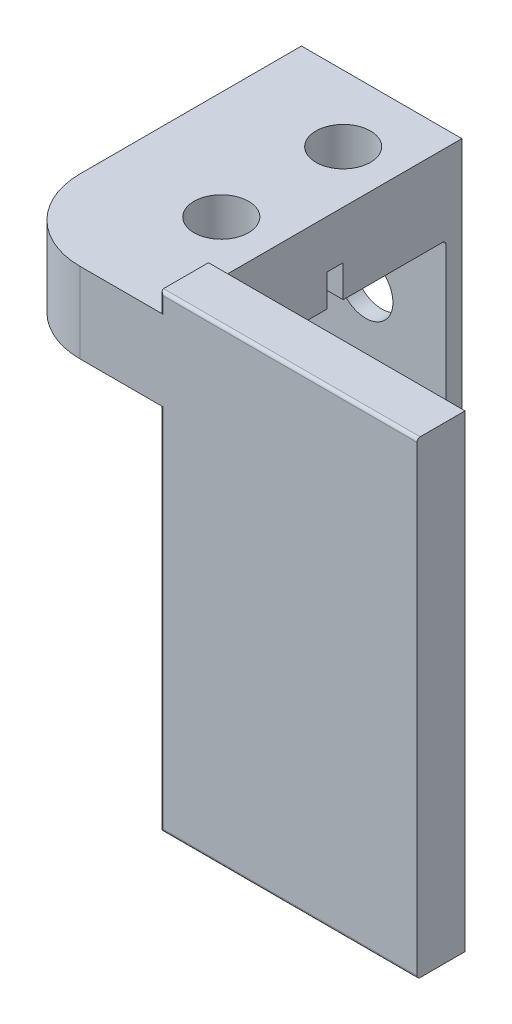
ISO-10303-21;
HEADER;
FILE_DESCRIPTION(('STEP AP214'),'2;1');
FILE_NAME('part.step','',(''),(''),'','','');
FILE_SCHEMA(('AUTOMOTIVE_DESIGN { 1 0 10303 214 1 1 1 1 }'));
ENDSEC;
DATA;
#1=APPLICATION_CONTEXT('core data for automotive mechanical design processes');
#2=APPLICATION_PROTOCOL_DEFINITION('international standard','automotive_design',2000,#1);
#3=PRODUCT_CONTEXT('',#1,'mechanical');
#4=PRODUCT('Part','Part','',(#3));
#5=PRODUCT_RELATED_PRODUCT_CATEGORY('part','',(#4));
#6=PRODUCT_DEFINITION_FORMATION('','',#4);
#7=PRODUCT_DEFINITION_CONTEXT('part definition',#1,'design');
#8=PRODUCT_DEFINITION('design','',#6,#7);
#9=PRODUCT_DEFINITION_SHAPE('','',#8);
#10=(LENGTH_UNIT() NAMED_UNIT(*) SI_UNIT(.MILLI.,.METRE.));
#11=(NAMED_UNIT(*) PLANE_ANGLE_UNIT() SI_UNIT($,.RADIAN.));
#12=(NAMED_UNIT(*) SI_UNIT($,.STERADIAN.) SOLID_ANGLE_UNIT());
#13=UNCERTAINTY_MEASURE_WITH_UNIT(LENGTH_MEASURE(1.E-05),#10,'distance_accuracy_value','');
#14=(GEOMETRIC_REPRESENTATION_CONTEXT(3) GLOBAL_UNCERTAINTY_ASSIGNED_CONTEXT((#13)) GLOBAL_UNIT_ASSIGNED_CONTEXT((#10,
#11,#12)) REPRESENTATION_CONTEXT('',''));
#15=CARTESIAN_POINT('',(0.,0.,0.));
#16=DIRECTION('',(0.,0.,1.));
#17=DIRECTION('',(1.,0.,0.));
#18=AXIS2_PLACEMENT_3D('',#15,#16,#17);
#19=CARTESIAN_POINT('',(0.,0.,0.));
#20=DIRECTION('',(0.,-1.,0.));
#21=DIRECTION('',(0.,0.,1.));
#22=AXIS2_PLACEMENT_3D('',#19,#20,#21);
#23=PLANE('',#22);
#24=DIRECTION('',(0.,0.,1.));
#25=VECTOR('',#24,1.);
#26=CARTESIAN_POINT('',(12.7,0.,0.));
#27=LINE('',#26,#25);
#28=CARTESIAN_POINT('',(12.7,0.,1.524));
#29=VERTEX_POINT('',#28);
#30=CARTESIAN_POINT('',(12.7,0.,9.398));
#31=VERTEX_POINT('',#30);
#32=EDGE_CURVE('E279',#29,#31,#27,.T.);
#33=ORIENTED_EDGE('',*,*,#32,.T.);
#34=DIRECTION('',(1.,0.,0.));
#35=VECTOR('',#34,1.);
#36=CARTESIAN_POINT('',(3.84196731264386,0.,9.398));
#37=LINE('',#36,#35);
#38=CARTESIAN_POINT('',(3.84196731264386,0.,9.398));
#39=VERTEX_POINT('',#38);
#40=EDGE_CURVE('E199',#39,#31,#37,.T.);
#41=ORIENTED_EDGE('',*,*,#40,.F.);
#42=DIRECTION('',(0.,0.,-1.));
#43=VECTOR('',#42,1.);
#44=CARTESIAN_POINT('',(3.84196731264386,0.,10.668));
#45=LINE('',#44,#43);
#46=CARTESIAN_POINT('',(3.84196731264386,0.,10.668));
#47=VERTEX_POINT('',#46);
#48=EDGE_CURVE('E180',#47,#39,#45,.T.);
#49=ORIENTED_EDGE('',*,*,#48,.F.);
#50=DIRECTION('',(1.,0.,0.));
#51=VECTOR('',#50,1.);
#52=CARTESIAN_POINT('',(3.84196731264386,0.,10.668));
#53=LINE('',#52,#51);
#54=CARTESIAN_POINT('',(12.7,0.,10.668));
#55=VERTEX_POINT('',#54);
#56=EDGE_CURVE('E186',#47,#55,#53,.T.);
#57=ORIENTED_EDGE('',*,*,#56,.T.);
#58=CARTESIAN_POINT('',(12.7,0.,20.066));
#59=VERTEX_POINT('',#58);
#60=EDGE_CURVE('E288',#55,#59,#27,.T.);
#61=ORIENTED_EDGE('',*,*,#60,.T.);
#62=DIRECTION('',(0.,0.,1.));
#63=VECTOR('',#62,1.);
#64=CARTESIAN_POINT('',(12.7,0.,20.066));
#65=LINE('',#64,#63);
#66=CARTESIAN_POINT('',(12.7,0.,23.622));
#67=VERTEX_POINT('',#66);
#68=EDGE_CURVE('E230',#59,#67,#65,.T.);
#69=ORIENTED_EDGE('',*,*,#68,.T.);
#70=CARTESIAN_POINT('',(12.954,0.,23.622));
#71=DIRECTION('',(0.,1.,0.));
#72=DIRECTION('',(0.,0.,1.));
#73=AXIS2_PLACEMENT_3D('',#70,#71,#72);
#74=CIRCLE('',#73,0.254);
#75=CARTESIAN_POINT('',(12.954,0.,23.876));
#76=VERTEX_POINT('',#75);
#77=EDGE_CURVE('E11',#76,#67,#74,.F.);
#78=ORIENTED_EDGE('',*,*,#77,.F.);
#79=DIRECTION('',(-1.,0.,0.));
#80=VECTOR('',#79,1.);
#81=CARTESIAN_POINT('',(0.,0.,23.876));
#82=LINE('',#81,#80);
#83=CARTESIAN_POINT('',(6.34999999999999,0.,23.876));
#84=VERTEX_POINT('',#83);
#85=EDGE_CURVE('E259',#76,#84,#82,.T.);
#86=ORIENTED_EDGE('',*,*,#85,.T.);
#87=CARTESIAN_POINT('',(6.34999999999999,0.,17.526));
#88=DIRECTION('',(0.,1.,0.));
#89=DIRECTION('',(0.,0.,1.));
#90=AXIS2_PLACEMENT_3D('',#87,#88,#89);
#91=CIRCLE('',#90,6.35);
#92=CARTESIAN_POINT('',(0.,0.,17.526));
#93=VERTEX_POINT('',#92);
#94=EDGE_CURVE('E301',#93,#84,#91,.T.);
#95=ORIENTED_EDGE('',*,*,#94,.F.);
#96=DIRECTION('',(0.,0.,-1.));
#97=VECTOR('',#96,1.);
#98=CARTESIAN_POINT('',(0.,0.,0.));
#99=LINE('',#98,#97);
#100=CARTESIAN_POINT('',(0.,0.,1.524));
#101=VERTEX_POINT('',#100);
#102=EDGE_CURVE('E270',#93,#101,#99,.T.);
#103=ORIENTED_EDGE('',*,*,#102,.T.);
#104=DIRECTION('',(-1.,0.,0.));
#105=VECTOR('',#104,1.);
#106=CARTESIAN_POINT('',(0.,0.,1.524));
#107=LINE('',#106,#105);
#108=EDGE_CURVE('E304',#29,#101,#107,.T.);
#109=ORIENTED_EDGE('',*,*,#108,.F.);
#110=EDGE_LOOP('',(#33,#41,#49,#57,#61,#69,#78,#86,#95,#103,#109));
#111=FACE_BOUND('',#110,.T.);
#112=CARTESIAN_POINT('',(8.55256241897667,0.,14.902));
#113=DIRECTION('',(0.,1.,0.));
#114=DIRECTION('',(0.,0.,1.));
#115=AXIS2_PLACEMENT_3D('',#112,#113,#114);
#116=CIRCLE('',#115,2.159);
#117=CARTESIAN_POINT('',(8.55256241897667,0.,17.061));
#118=VERTEX_POINT('',#117);
#119=EDGE_CURVE('E266',#118,#118,#116,.F.);
#120=ORIENTED_EDGE('',*,*,#119,.F.);
#121=EDGE_LOOP('',(#120));
#122=FACE_BOUND('',#121,.T.);
#123=CARTESIAN_POINT('',(8.55256241897667,0.,5.25000000000001));
#124=DIRECTION('',(0.,1.,0.));
#125=DIRECTION('',(0.,0.,1.));
#126=AXIS2_PLACEMENT_3D('',#123,#124,#125);
#127=CIRCLE('',#126,2.159);
#128=CARTESIAN_POINT('',(8.55256241897667,0.,7.40900000000001));
#129=VERTEX_POINT('',#128);
#130=EDGE_CURVE('E262',#129,#129,#127,.F.);
#131=ORIENTED_EDGE('',*,*,#130,.F.);
#132=EDGE_LOOP('',(#131));
#133=FACE_BOUND('',#132,.T.);
#134=ADVANCED_FACE('F43',(#111,#122,#133),#23,.T.);
#135=CARTESIAN_POINT('',(33.02,0.,23.876));
#136=DIRECTION('',(-1.,0.,0.));
#137=DIRECTION('',(0.,0.,-1.));
#138=AXIS2_PLACEMENT_3D('',#135,#136,#137);
#139=PLANE('',#138);
#140=DIRECTION('',(0.,-1.,0.));
#141=VECTOR('',#140,1.);
#142=CARTESIAN_POINT('',(33.02,0.,23.876));
#143=LINE('',#142,#141);
#144=CARTESIAN_POINT('',(33.02,7.62,23.876));
#145=VERTEX_POINT('',#144);
#146=CARTESIAN_POINT('',(33.02,-28.956,23.876));
#147=VERTEX_POINT('',#146);
#148=EDGE_CURVE('E256',#145,#147,#143,.T.);
#149=ORIENTED_EDGE('',*,*,#148,.T.);
#150=CARTESIAN_POINT('',(33.02,-28.956,23.622));
#151=DIRECTION('',(1.,0.,0.));
#152=DIRECTION('',(0.,0.,-1.));
#153=AXIS2_PLACEMENT_3D('',#150,#151,#152);
#154=CIRCLE('',#153,0.254);
#155=CARTESIAN_POINT('',(33.02,-29.21,23.622));
#156=VERTEX_POINT('',#155);
#157=EDGE_CURVE('E323',#156,#147,#154,.F.);
#158=ORIENTED_EDGE('',*,*,#157,.F.);
#159=DIRECTION('',(0.,0.,1.));
#160=VECTOR('',#159,1.);
#161=CARTESIAN_POINT('',(33.02,-29.21,20.066));
#162=LINE('',#161,#160);
#163=CARTESIAN_POINT('',(33.02,-29.21,20.066));
#164=VERTEX_POINT('',#163);
#165=EDGE_CURVE('E229',#164,#156,#162,.T.);
#166=ORIENTED_EDGE('',*,*,#165,.F.);
#167=DIRECTION('',(0.,-1.,0.));
#168=VECTOR('',#167,1.);
#169=CARTESIAN_POINT('',(33.02,6.35,20.066));
#170=LINE('',#169,#168);
#171=CARTESIAN_POINT('',(33.02,7.874,20.066));
#172=VERTEX_POINT('',#171);
#173=EDGE_CURVE('E233',#172,#164,#170,.T.);
#174=ORIENTED_EDGE('',*,*,#173,.F.);
#175=DIRECTION('',(0.,0.,1.));
#176=VECTOR('',#175,1.);
#177=CARTESIAN_POINT('',(33.02,7.874,20.066));
#178=LINE('',#177,#176);
#179=CARTESIAN_POINT('',(33.02,7.874,23.622));
#180=VERTEX_POINT('',#179);
#181=EDGE_CURVE('E245',#172,#180,#178,.T.);
#182=ORIENTED_EDGE('',*,*,#181,.T.);
#183=CARTESIAN_POINT('',(33.02,7.62,23.622));
#184=DIRECTION('',(1.,0.,0.));
#185=DIRECTION('',(0.,0.,-1.));
#186=AXIS2_PLACEMENT_3D('',#183,#184,#185);
#187=CIRCLE('',#186,0.254);
#188=EDGE_CURVE('E326',#145,#180,#187,.F.);
#189=ORIENTED_EDGE('',*,*,#188,.F.);
#190=EDGE_LOOP('',(#149,#158,#166,#174,#182,#189));
#191=FACE_BOUND('',#190,.T.);
#192=ADVANCED_FACE('F415',(#191),#139,.F.);
#193=CARTESIAN_POINT('',(0.,6.35,0.));
#194=DIRECTION('',(1.,0.,0.));
#195=DIRECTION('',(0.,0.,1.));
#196=AXIS2_PLACEMENT_3D('',#193,#194,#195);
#197=PLANE('',#196);
#198=DIRECTION('',(0.,0.,-1.));
#199=VECTOR('',#198,1.);
#200=CARTESIAN_POINT('',(0.,6.35,0.));
#201=LINE('',#200,#199);
#202=CARTESIAN_POINT('',(0.,6.35,17.526));
#203=VERTEX_POINT('',#202);
#204=CARTESIAN_POINT('',(0.,6.35,0.));
#205=VERTEX_POINT('',#204);
#206=EDGE_CURVE('E275',#203,#205,#201,.T.);
#207=ORIENTED_EDGE('',*,*,#206,.T.);
#208=DIRECTION('',(0.,-1.,0.));
#209=VECTOR('',#208,1.);
#210=CARTESIAN_POINT('',(0.,6.35,0.));
#211=LINE('',#210,#209);
#212=CARTESIAN_POINT('',(0.,-12.7,0.));
#213=VERTEX_POINT('',#212);
#214=EDGE_CURVE('E292',#205,#213,#211,.T.);
#215=ORIENTED_EDGE('',*,*,#214,.T.);
#216=DIRECTION('',(0.,0.,-1.));
#217=VECTOR('',#216,1.);
#218=CARTESIAN_POINT('',(0.,-12.7,1.27));
#219=LINE('',#218,#217);
#220=CARTESIAN_POINT('',(0.,-12.7,1.27));
#221=VERTEX_POINT('',#220);
#222=EDGE_CURVE('E214',#221,#213,#219,.T.);
#223=ORIENTED_EDGE('',*,*,#222,.F.);
#224=DIRECTION('',(0.,-1.,0.));
#225=VECTOR('',#224,1.);
#226=CARTESIAN_POINT('',(0.,6.35,1.27));
#227=LINE('',#226,#225);
#228=CARTESIAN_POINT('',(0.,-0.253999999999998,1.27));
#229=VERTEX_POINT('',#228);
#230=EDGE_CURVE('E206',#229,#221,#227,.T.);
#231=ORIENTED_EDGE('',*,*,#230,.F.);
#232=CARTESIAN_POINT('',(0.,-0.254,1.524));
#233=DIRECTION('',(-1.,0.,0.));
#234=DIRECTION('',(0.,0.,1.));
#235=AXIS2_PLACEMENT_3D('',#232,#233,#234);
#236=CIRCLE('',#235,0.254);
#237=EDGE_CURVE('E309',#101,#229,#236,.T.);
#238=ORIENTED_EDGE('',*,*,#237,.F.);
#239=ORIENTED_EDGE('',*,*,#102,.F.);
#240=DIRECTION('',(0.,1.,0.));
#241=VECTOR('',#240,1.);
#242=CARTESIAN_POINT('',(0.,0.,17.526));
#243=LINE('',#242,#241);
#244=EDGE_CURVE('E299',#203,#93,#243,.F.);
#245=ORIENTED_EDGE('',*,*,#244,.F.);
#246=EDGE_LOOP('',(#207,#215,#223,#231,#238,#239,#245));
#247=FACE_BOUND('',#246,.T.);
#248=ADVANCED_FACE('F385',(#247),#197,.F.);
#249=CARTESIAN_POINT('',(0.,6.35,0.));
#250=DIRECTION('',(0.,0.,1.));
#251=DIRECTION('',(-1.,0.,0.));
#252=AXIS2_PLACEMENT_3D('',#249,#250,#251);
#253=PLANE('',#252);
#254=CARTESIAN_POINT('',(6.35,-6.35,0.));
#255=DIRECTION('',(0.,0.,-1.));
#256=DIRECTION('',(-1.,0.,0.));
#257=AXIS2_PLACEMENT_3D('',#254,#255,#256);
#258=CIRCLE('',#257,2.159);
#259=CARTESIAN_POINT('',(4.191,-6.35,0.));
#260=VERTEX_POINT('',#259);
#261=EDGE_CURVE('E343',#260,#260,#258,.F.);
#262=ORIENTED_EDGE('',*,*,#261,.T.);
#263=EDGE_LOOP('',(#262));
#264=FACE_BOUND('',#263,.T.);
#265=ORIENTED_EDGE('',*,*,#214,.F.);
#266=DIRECTION('',(1.,0.,0.));
#267=VECTOR('',#266,1.);
#268=CARTESIAN_POINT('',(0.,6.35,0.));
#269=LINE('',#268,#267);
#270=CARTESIAN_POINT('',(12.7,6.35,0.));
#271=VERTEX_POINT('',#270);
#272=EDGE_CURVE('E278',#205,#271,#269,.T.);
#273=ORIENTED_EDGE('',*,*,#272,.T.);
#274=DIRECTION('',(0.,-1.,0.));
#275=VECTOR('',#274,1.);
#276=CARTESIAN_POINT('',(12.7,6.35,0.));
#277=LINE('',#276,#275);
#278=CARTESIAN_POINT('',(12.7,-12.7,0.));
#279=VERTEX_POINT('',#278);
#280=EDGE_CURVE('E285',#271,#279,#277,.T.);
#281=ORIENTED_EDGE('',*,*,#280,.T.);
#282=DIRECTION('',(1.,0.,0.));
#283=VECTOR('',#282,1.);
#284=CARTESIAN_POINT('',(0.,-12.7,0.));
#285=LINE('',#284,#283);
#286=EDGE_CURVE('E201',#213,#279,#285,.T.);
#287=ORIENTED_EDGE('',*,*,#286,.F.);
#288=EDGE_LOOP('',(#265,#273,#281,#287));
#289=FACE_BOUND('',#288,.T.);
#290=ADVANCED_FACE('F400',(#264,#289),#253,.F.);
#291=CARTESIAN_POINT('',(12.7,6.35,0.));
#292=DIRECTION('',(-1.,0.,0.));
#293=DIRECTION('',(0.,0.,-1.));
#294=AXIS2_PLACEMENT_3D('',#291,#292,#293);
#295=PLANE('',#294);
#296=DIRECTION('',(0.,0.,-1.));
#297=VECTOR('',#296,1.);
#298=CARTESIAN_POINT('',(12.7,2.54,10.668));
#299=LINE('',#298,#297);
#300=CARTESIAN_POINT('',(12.7,2.54,10.668));
#301=VERTEX_POINT('',#300);
#302=CARTESIAN_POINT('',(12.7,2.54,9.398));
#303=VERTEX_POINT('',#302);
#304=EDGE_CURVE('E183',#301,#303,#299,.T.);
#305=ORIENTED_EDGE('',*,*,#304,.T.);
#306=DIRECTION('',(0.,1.,0.));
#307=VECTOR('',#306,1.);
#308=CARTESIAN_POINT('',(12.7,2.54,9.398));
#309=LINE('',#308,#307);
#310=EDGE_CURVE('E187',#31,#303,#309,.T.);
#311=ORIENTED_EDGE('',*,*,#310,.F.);
#312=ORIENTED_EDGE('',*,*,#32,.F.);
#313=CARTESIAN_POINT('',(12.7,-0.254,1.524));
#314=DIRECTION('',(1.,0.,0.));
#315=DIRECTION('',(0.,0.,-1.));
#316=AXIS2_PLACEMENT_3D('',#313,#314,#315);
#317=CIRCLE('',#316,0.254);
#318=CARTESIAN_POINT('',(12.7,-0.253999999999998,1.27));
#319=VERTEX_POINT('',#318);
#320=EDGE_CURVE('E312',#319,#29,#317,.T.);
#321=ORIENTED_EDGE('',*,*,#320,.F.);
#322=DIRECTION('',(0.,1.,0.));
#323=VECTOR('',#322,1.);
#324=CARTESIAN_POINT('',(12.7,6.35,1.27));
#325=LINE('',#324,#323);
#326=CARTESIAN_POINT('',(12.7,-12.7,1.27));
#327=VERTEX_POINT('',#326);
#328=EDGE_CURVE('E211',#327,#319,#325,.T.);
#329=ORIENTED_EDGE('',*,*,#328,.F.);
#330=DIRECTION('',(0.,0.,-1.));
#331=VECTOR('',#330,1.);
#332=CARTESIAN_POINT('',(12.7,-12.7,1.27));
#333=LINE('',#332,#331);
#334=EDGE_CURVE('E217',#327,#279,#333,.T.);
#335=ORIENTED_EDGE('',*,*,#334,.T.);
#336=ORIENTED_EDGE('',*,*,#280,.F.);
#337=DIRECTION('',(0.,0.,1.));
#338=VECTOR('',#337,1.);
#339=CARTESIAN_POINT('',(12.7,6.35,0.));
#340=LINE('',#339,#338);
#341=CARTESIAN_POINT('',(12.7,6.35,20.066));
#342=VERTEX_POINT('',#341);
#343=EDGE_CURVE('E282',#271,#342,#340,.T.);
#344=ORIENTED_EDGE('',*,*,#343,.T.);
#345=DIRECTION('',(0.,1.,0.));
#346=VECTOR('',#345,1.);
#347=CARTESIAN_POINT('',(12.7,6.35,20.066));
#348=LINE('',#347,#346);
#349=EDGE_CURVE('E219',#59,#342,#348,.T.);
#350=ORIENTED_EDGE('',*,*,#349,.F.);
#351=ORIENTED_EDGE('',*,*,#60,.F.);
#352=DIRECTION('',(0.,1.,0.));
#353=VECTOR('',#352,1.);
#354=CARTESIAN_POINT('',(12.7,2.54,10.668));
#355=LINE('',#354,#353);
#356=EDGE_CURVE('E191',#55,#301,#355,.T.);
#357=ORIENTED_EDGE('',*,*,#356,.T.);
#358=EDGE_LOOP('',(#305,#311,#312,#321,#329,#335,#336,#344,#350,#351,#357));
#359=FACE_BOUND('',#358,.T.);
#360=ADVANCED_FACE('F357',(#359),#295,.F.);
#361=CARTESIAN_POINT('',(0.,6.35,0.));
#362=DIRECTION('',(0.,-1.,0.));
#363=DIRECTION('',(0.,0.,1.));
#364=AXIS2_PLACEMENT_3D('',#361,#362,#363);
#365=PLANE('',#364);
#366=DIRECTION('',(1.,0.,0.));
#367=VECTOR('',#366,1.);
#368=CARTESIAN_POINT('',(0.,6.35,23.876));
#369=LINE('',#368,#367);
#370=CARTESIAN_POINT('',(6.34999999999999,6.35,23.876));
#371=VERTEX_POINT('',#370);
#372=CARTESIAN_POINT('',(12.954,6.35,23.876));
#373=VERTEX_POINT('',#372);
#374=EDGE_CURVE('E248',#371,#373,#369,.T.);
#375=ORIENTED_EDGE('',*,*,#374,.T.);
#376=CARTESIAN_POINT('',(12.954,6.35,23.622));
#377=DIRECTION('',(0.,1.,0.));
#378=DIRECTION('',(0.,0.,1.));
#379=AXIS2_PLACEMENT_3D('',#376,#377,#378);
#380=CIRCLE('',#379,0.254);
#381=CARTESIAN_POINT('',(12.7,6.35,23.622));
#382=VERTEX_POINT('',#381);
#383=EDGE_CURVE('E52',#382,#373,#380,.T.);
#384=ORIENTED_EDGE('',*,*,#383,.F.);
#385=DIRECTION('',(0.,0.,1.));
#386=VECTOR('',#385,1.);
#387=CARTESIAN_POINT('',(12.7,6.35,20.066));
#388=LINE('',#387,#386);
#389=EDGE_CURVE('E244',#342,#382,#388,.T.);
#390=ORIENTED_EDGE('',*,*,#389,.F.);
#391=ORIENTED_EDGE('',*,*,#343,.F.);
#392=ORIENTED_EDGE('',*,*,#272,.F.);
#393=ORIENTED_EDGE('',*,*,#206,.F.);
#394=CARTESIAN_POINT('',(6.34999999999999,6.35,17.526));
#395=DIRECTION('',(0.,1.,0.));
#396=DIRECTION('',(0.,0.,1.));
#397=AXIS2_PLACEMENT_3D('',#394,#395,#396);
#398=CIRCLE('',#397,6.35);
#399=EDGE_CURVE('E297',#371,#203,#398,.F.);
#400=ORIENTED_EDGE('',*,*,#399,.F.);
#401=EDGE_LOOP('',(#375,#384,#390,#391,#392,#393,#400));
#402=FACE_BOUND('',#401,.T.);
#403=CARTESIAN_POINT('',(8.55256241897667,6.35,5.25000000000001));
#404=DIRECTION('',(0.,-1.,0.));
#405=DIRECTION('',(0.,0.,-1.));
#406=AXIS2_PLACEMENT_3D('',#403,#404,#405);
#407=CIRCLE('',#406,2.159);
#408=CARTESIAN_POINT('',(8.55256241897667,6.35,3.09100000000001));
#409=VERTEX_POINT('',#408);
#410=EDGE_CURVE('E267',#409,#409,#407,.T.);
#411=ORIENTED_EDGE('',*,*,#410,.T.);
#412=EDGE_LOOP('',(#411));
#413=FACE_BOUND('',#412,.T.);
#414=CARTESIAN_POINT('',(8.55256241897667,6.35,14.902));
#415=DIRECTION('',(0.,-1.,0.));
#416=DIRECTION('',(0.,0.,-1.));
#417=AXIS2_PLACEMENT_3D('',#414,#415,#416);
#418=CIRCLE('',#417,2.159);
#419=CARTESIAN_POINT('',(8.55256241897667,6.35,12.743));
#420=VERTEX_POINT('',#419);
#421=EDGE_CURVE('E263',#420,#420,#418,.T.);
#422=ORIENTED_EDGE('',*,*,#421,.T.);
#423=EDGE_LOOP('',(#422));
#424=FACE_BOUND('',#423,.T.);
#425=ADVANCED_FACE('F403',(#402,#413,#424),#365,.F.);
#426=CARTESIAN_POINT('',(8.55256241897667,-6.10657416232702,5.25000000000001));
#427=DIRECTION('',(0.,1.,0.));
#428=DIRECTION('',(0.,0.,-1.));
#429=AXIS2_PLACEMENT_3D('',#426,#427,#428);
#430=CYLINDRICAL_SURFACE('',#429,2.159);
#431=ORIENTED_EDGE('',*,*,#410,.F.);
#432=EDGE_LOOP('',(#431));
#433=FACE_BOUND('',#432,.T.);
#434=ORIENTED_EDGE('',*,*,#130,.T.);
#435=EDGE_LOOP('',(#434));
#436=FACE_BOUND('',#435,.T.);
#437=ADVANCED_FACE('F481',(#433,#436),#430,.F.);
#438=CARTESIAN_POINT('',(8.55256241897667,-6.10657416232702,14.902));
#439=DIRECTION('',(0.,1.,0.));
#440=DIRECTION('',(0.,0.,-1.));
#441=AXIS2_PLACEMENT_3D('',#438,#439,#440);
#442=CYLINDRICAL_SURFACE('',#441,2.159);
#443=ORIENTED_EDGE('',*,*,#421,.F.);
#444=EDGE_LOOP('',(#443));
#445=FACE_BOUND('',#444,.T.);
#446=ORIENTED_EDGE('',*,*,#119,.T.);
#447=EDGE_LOOP('',(#446));
#448=FACE_BOUND('',#447,.T.);
#449=ADVANCED_FACE('F478',(#445,#448),#442,.F.);
#450=CARTESIAN_POINT('',(0.,0.,23.876));
#451=DIRECTION('',(0.,0.,1.));
#452=DIRECTION('',(-1.,0.,0.));
#453=AXIS2_PLACEMENT_3D('',#450,#451,#452);
#454=PLANE('',#453);
#455=DIRECTION('',(0.,1.,0.));
#456=VECTOR('',#455,1.);
#457=CARTESIAN_POINT('',(12.954,0.,23.876));
#458=LINE('',#457,#456);
#459=CARTESIAN_POINT('',(12.954,7.62,23.876));
#460=VERTEX_POINT('',#459);
#461=EDGE_CURVE('E318',#373,#460,#458,.T.);
#462=ORIENTED_EDGE('',*,*,#461,.F.);
#463=ORIENTED_EDGE('',*,*,#374,.F.);
#464=DIRECTION('',(0.,1.,0.));
#465=VECTOR('',#464,1.);
#466=CARTESIAN_POINT('',(6.34999999999999,6.35,23.876));
#467=LINE('',#466,#465);
#468=EDGE_CURVE('E295',#84,#371,#467,.T.);
#469=ORIENTED_EDGE('',*,*,#468,.F.);
#470=ORIENTED_EDGE('',*,*,#85,.F.);
#471=DIRECTION('',(0.,1.,0.));
#472=VECTOR('',#471,1.);
#473=CARTESIAN_POINT('',(12.954,0.,23.876));
#474=LINE('',#473,#472);
#475=CARTESIAN_POINT('',(12.954,-28.956,23.876));
#476=VERTEX_POINT('',#475);
#477=EDGE_CURVE('E316',#476,#76,#474,.T.);
#478=ORIENTED_EDGE('',*,*,#477,.F.);
#479=DIRECTION('',(-1.,0.,0.));
#480=VECTOR('',#479,1.);
#481=CARTESIAN_POINT('',(0.,-28.956,23.876));
#482=LINE('',#481,#480);
#483=EDGE_CURVE('E314',#147,#476,#482,.T.);
#484=ORIENTED_EDGE('',*,*,#483,.F.);
#485=ORIENTED_EDGE('',*,*,#148,.F.);
#486=DIRECTION('',(1.,0.,0.));
#487=VECTOR('',#486,1.);
#488=CARTESIAN_POINT('',(0.,7.62,23.876));
#489=LINE('',#488,#487);
#490=EDGE_CURVE('E321',#460,#145,#489,.T.);
#491=ORIENTED_EDGE('',*,*,#490,.F.);
#492=EDGE_LOOP('',(#462,#463,#469,#470,#478,#484,#485,#491));
#493=FACE_BOUND('',#492,.T.);
#494=ADVANCED_FACE('F374',(#493),#454,.T.);
#495=CARTESIAN_POINT('',(33.02,7.874,20.066));
#496=DIRECTION('',(0.,1.,0.));
#497=DIRECTION('',(0.,0.,-1.));
#498=AXIS2_PLACEMENT_3D('',#495,#496,#497);
#499=PLANE('',#498);
#500=ORIENTED_EDGE('',*,*,#181,.F.);
#501=DIRECTION('',(1.,0.,0.));
#502=VECTOR('',#501,1.);
#503=CARTESIAN_POINT('',(33.02,7.874,20.066));
#504=LINE('',#503,#502);
#505=CARTESIAN_POINT('',(12.7,7.874,20.066));
#506=VERTEX_POINT('',#505);
#507=EDGE_CURVE('E242',#506,#172,#504,.T.);
#508=ORIENTED_EDGE('',*,*,#507,.F.);
#509=DIRECTION('',(0.,0.,1.));
#510=VECTOR('',#509,1.);
#511=CARTESIAN_POINT('',(12.7,7.874,20.066));
#512=LINE('',#511,#510);
#513=CARTESIAN_POINT('',(12.7,7.874,23.622));
#514=VERTEX_POINT('',#513);
#515=EDGE_CURVE('E249',#506,#514,#512,.T.);
#516=ORIENTED_EDGE('',*,*,#515,.T.);
#517=DIRECTION('',(1.,0.,0.));
#518=VECTOR('',#517,1.);
#519=CARTESIAN_POINT('',(33.02,7.874,23.622));
#520=LINE('',#519,#518);
#521=EDGE_CURVE('E329',#180,#514,#520,.F.);
#522=ORIENTED_EDGE('',*,*,#521,.F.);
#523=EDGE_LOOP('',(#500,#508,#516,#522));
#524=FACE_BOUND('',#523,.T.);
#525=ADVANCED_FACE('F412',(#524),#499,.T.);
#526=CARTESIAN_POINT('',(12.7,6.35,20.066));
#527=DIRECTION('',(-1.,0.,0.));
#528=DIRECTION('',(0.,0.,-1.));
#529=AXIS2_PLACEMENT_3D('',#526,#527,#528);
#530=PLANE('',#529);
#531=ORIENTED_EDGE('',*,*,#515,.F.);
#532=DIRECTION('',(0.,1.,0.));
#533=VECTOR('',#532,1.);
#534=CARTESIAN_POINT('',(12.7,6.35,20.066));
#535=LINE('',#534,#533);
#536=EDGE_CURVE('E240',#342,#506,#535,.T.);
#537=ORIENTED_EDGE('',*,*,#536,.F.);
#538=ORIENTED_EDGE('',*,*,#389,.T.);
#539=DIRECTION('',(0.,1.,0.));
#540=VECTOR('',#539,1.);
#541=CARTESIAN_POINT('',(12.7,6.35,23.622));
#542=LINE('',#541,#540);
#543=EDGE_CURVE('E332',#514,#382,#542,.F.);
#544=ORIENTED_EDGE('',*,*,#543,.F.);
#545=EDGE_LOOP('',(#531,#537,#538,#544));
#546=FACE_BOUND('',#545,.T.);
#547=ADVANCED_FACE('F410',(#546),#530,.T.);
#548=CARTESIAN_POINT('',(0.,0.,20.066));
#549=DIRECTION('',(0.,0.,-1.));
#550=DIRECTION('',(1.,0.,0.));
#551=AXIS2_PLACEMENT_3D('',#548,#549,#550);
#552=PLANE('',#551);
#553=ORIENTED_EDGE('',*,*,#173,.T.);
#554=DIRECTION('',(-1.,0.,0.));
#555=VECTOR('',#554,1.);
#556=CARTESIAN_POINT('',(33.02,-29.21,20.066));
#557=LINE('',#556,#555);
#558=CARTESIAN_POINT('',(12.7,-29.21,20.066));
#559=VERTEX_POINT('',#558);
#560=EDGE_CURVE('E224',#164,#559,#557,.T.);
#561=ORIENTED_EDGE('',*,*,#560,.T.);
#562=DIRECTION('',(0.,1.,0.));
#563=VECTOR('',#562,1.);
#564=CARTESIAN_POINT('',(12.7,0.,20.066));
#565=LINE('',#564,#563);
#566=EDGE_CURVE('E227',#559,#59,#565,.T.);
#567=ORIENTED_EDGE('',*,*,#566,.T.);
#568=ORIENTED_EDGE('',*,*,#349,.T.);
#569=ORIENTED_EDGE('',*,*,#536,.T.);
#570=ORIENTED_EDGE('',*,*,#507,.T.);
#571=EDGE_LOOP('',(#553,#561,#567,#568,#569,#570));
#572=FACE_BOUND('',#571,.T.);
#573=ADVANCED_FACE('F363',(#572),#552,.T.);
#574=CARTESIAN_POINT('',(12.7,0.,20.066));
#575=DIRECTION('',(-1.,0.,0.));
#576=DIRECTION('',(0.,-1.,0.));
#577=AXIS2_PLACEMENT_3D('',#574,#575,#576);
#578=PLANE('',#577);
#579=ORIENTED_EDGE('',*,*,#68,.F.);
#580=ORIENTED_EDGE('',*,*,#566,.F.);
#581=DIRECTION('',(0.,0.,1.));
#582=VECTOR('',#581,1.);
#583=CARTESIAN_POINT('',(12.7,-29.21,20.066));
#584=LINE('',#583,#582);
#585=CARTESIAN_POINT('',(12.7,-29.21,23.622));
#586=VERTEX_POINT('',#585);
#587=EDGE_CURVE('E234',#559,#586,#584,.T.);
#588=ORIENTED_EDGE('',*,*,#587,.T.);
#589=DIRECTION('',(0.,1.,0.));
#590=VECTOR('',#589,1.);
#591=CARTESIAN_POINT('',(12.7,0.,23.622));
#592=LINE('',#591,#590);
#593=EDGE_CURVE('E60',#67,#586,#592,.F.);
#594=ORIENTED_EDGE('',*,*,#593,.F.);
#595=EDGE_LOOP('',(#579,#580,#588,#594));
#596=FACE_BOUND('',#595,.T.);
#597=ADVANCED_FACE('F361',(#596),#578,.T.);
#598=CARTESIAN_POINT('',(33.02,-29.21,20.066));
#599=DIRECTION('',(0.,-1.,0.));
#600=DIRECTION('',(0.,0.,1.));
#601=AXIS2_PLACEMENT_3D('',#598,#599,#600);
#602=PLANE('',#601);
#603=ORIENTED_EDGE('',*,*,#587,.F.);
#604=ORIENTED_EDGE('',*,*,#560,.F.);
#605=ORIENTED_EDGE('',*,*,#165,.T.);
#606=DIRECTION('',(-1.,0.,0.));
#607=VECTOR('',#606,1.);
#608=CARTESIAN_POINT('',(33.02,-29.21,23.622));
#609=LINE('',#608,#607);
#610=EDGE_CURVE('E335',#586,#156,#609,.F.);
#611=ORIENTED_EDGE('',*,*,#610,.F.);
#612=EDGE_LOOP('',(#603,#604,#605,#611));
#613=FACE_BOUND('',#612,.T.);
#614=ADVANCED_FACE('F367',(#613),#602,.T.);
#615=CARTESIAN_POINT('',(0.,-12.7,1.27));
#616=DIRECTION('',(0.,-1.,0.));
#617=DIRECTION('',(0.,0.,1.));
#618=AXIS2_PLACEMENT_3D('',#615,#616,#617);
#619=PLANE('',#618);
#620=ORIENTED_EDGE('',*,*,#286,.T.);
#621=ORIENTED_EDGE('',*,*,#334,.F.);
#622=DIRECTION('',(1.,0.,0.));
#623=VECTOR('',#622,1.);
#624=CARTESIAN_POINT('',(0.,-12.7,1.27));
#625=LINE('',#624,#623);
#626=EDGE_CURVE('E209',#221,#327,#625,.T.);
#627=ORIENTED_EDGE('',*,*,#626,.F.);
#628=ORIENTED_EDGE('',*,*,#222,.T.);
#629=EDGE_LOOP('',(#620,#621,#627,#628));
#630=FACE_BOUND('',#629,.T.);
#631=ADVANCED_FACE('F397',(#630),#619,.T.);
#632=CARTESIAN_POINT('',(0.,0.,1.27));
#633=DIRECTION('',(0.,0.,-1.));
#634=DIRECTION('',(1.,0.,0.));
#635=AXIS2_PLACEMENT_3D('',#632,#633,#634);
#636=PLANE('',#635);
#637=CARTESIAN_POINT('',(6.35,-6.35,1.27));
#638=DIRECTION('',(0.,0.,-1.));
#639=DIRECTION('',(-1.,0.,0.));
#640=AXIS2_PLACEMENT_3D('',#637,#638,#639);
#641=CIRCLE('',#640,2.159);
#642=CARTESIAN_POINT('',(4.191,-6.35,1.27));
#643=VERTEX_POINT('',#642);
#644=EDGE_CURVE('E339',#643,#643,#641,.T.);
#645=ORIENTED_EDGE('',*,*,#644,.T.);
#646=EDGE_LOOP('',(#645));
#647=FACE_BOUND('',#646,.T.);
#648=ORIENTED_EDGE('',*,*,#230,.T.);
#649=ORIENTED_EDGE('',*,*,#626,.T.);
#650=ORIENTED_EDGE('',*,*,#328,.T.);
#651=DIRECTION('',(-1.,0.,0.));
#652=VECTOR('',#651,1.);
#653=CARTESIAN_POINT('',(0.,-0.254,1.27));
#654=LINE('',#653,#652);
#655=EDGE_CURVE('E307',#229,#319,#654,.F.);
#656=ORIENTED_EDGE('',*,*,#655,.F.);
#657=EDGE_LOOP('',(#648,#649,#650,#656));
#658=FACE_BOUND('',#657,.T.);
#659=ADVANCED_FACE('F395',(#647,#658),#636,.F.);
#660=CARTESIAN_POINT('',(3.84196731264386,0.,10.668));
#661=DIRECTION('',(-0.275637355816993,0.961261695938321,0.));
#662=DIRECTION('',(-0.961261695938321,-0.275637355816993,0.));
#663=AXIS2_PLACEMENT_3D('',#660,#661,#662);
#664=PLANE('',#663);
#665=DIRECTION('',(-0.961261695938321,-0.275637355816993,0.));
#666=VECTOR('',#665,1.);
#667=CARTESIAN_POINT('',(3.84196731264386,0.,9.398));
#668=LINE('',#667,#666);
#669=EDGE_CURVE('E348',#303,#39,#668,.T.);
#670=ORIENTED_EDGE('',*,*,#669,.F.);
#671=ORIENTED_EDGE('',*,*,#304,.F.);
#672=DIRECTION('',(-0.961261695938321,-0.275637355816993,0.));
#673=VECTOR('',#672,1.);
#674=CARTESIAN_POINT('',(3.84196731264386,0.,10.668));
#675=LINE('',#674,#673);
#676=EDGE_CURVE('E176',#301,#47,#675,.T.);
#677=ORIENTED_EDGE('',*,*,#676,.T.);
#678=ORIENTED_EDGE('',*,*,#48,.T.);
#679=EDGE_LOOP('',(#670,#671,#677,#678));
#680=FACE_BOUND('',#679,.T.);
#681=ADVANCED_FACE('F178',(#680),#664,.F.);
#682=CARTESIAN_POINT('',(0.,0.,10.668));
#683=DIRECTION('',(0.,0.,1.));
#684=DIRECTION('',(-1.,0.,0.));
#685=AXIS2_PLACEMENT_3D('',#682,#683,#684);
#686=PLANE('',#685);
#687=ORIENTED_EDGE('',*,*,#676,.F.);
#688=ORIENTED_EDGE('',*,*,#356,.F.);
#689=ORIENTED_EDGE('',*,*,#56,.F.);
#690=EDGE_LOOP('',(#687,#688,#689));
#691=FACE_BOUND('',#690,.T.);
#692=ADVANCED_FACE('F190',(#691),#686,.F.);
#693=CARTESIAN_POINT('',(0.,0.,9.398));
#694=DIRECTION('',(0.,0.,1.));
#695=DIRECTION('',(-1.,0.,0.));
#696=AXIS2_PLACEMENT_3D('',#693,#694,#695);
#697=PLANE('',#696);
#698=ORIENTED_EDGE('',*,*,#669,.T.);
#699=ORIENTED_EDGE('',*,*,#40,.T.);
#700=ORIENTED_EDGE('',*,*,#310,.T.);
#701=EDGE_LOOP('',(#698,#699,#700));
#702=FACE_BOUND('',#701,.T.);
#703=ADVANCED_FACE('F354',(#702),#697,.T.);
#704=CARTESIAN_POINT('',(6.35,-6.35,-6.10657416232702));
#705=DIRECTION('',(0.,0.,1.));
#706=DIRECTION('',(-1.,0.,0.));
#707=AXIS2_PLACEMENT_3D('',#704,#705,#706);
#708=CYLINDRICAL_SURFACE('',#707,2.159);
#709=ORIENTED_EDGE('',*,*,#261,.F.);
#710=EDGE_LOOP('',(#709));
#711=FACE_BOUND('',#710,.T.);
#712=ORIENTED_EDGE('',*,*,#644,.F.);
#713=EDGE_LOOP('',(#712));
#714=FACE_BOUND('',#713,.T.);
#715=ADVANCED_FACE('F446',(#711,#714),#708,.F.);
#716=CARTESIAN_POINT('',(6.34999999999999,0.,17.526));
#717=DIRECTION('',(0.,-1.,0.));
#718=DIRECTION('',(0.,0.,1.));
#719=AXIS2_PLACEMENT_3D('',#716,#717,#718);
#720=CYLINDRICAL_SURFACE('',#719,6.35);
#721=ORIENTED_EDGE('',*,*,#94,.T.);
#722=ORIENTED_EDGE('',*,*,#468,.T.);
#723=ORIENTED_EDGE('',*,*,#399,.T.);
#724=ORIENTED_EDGE('',*,*,#244,.T.);
#725=EDGE_LOOP('',(#721,#722,#723,#724));
#726=FACE_BOUND('',#725,.T.);
#727=ADVANCED_FACE('F380',(#726),#720,.T.);
#728=CARTESIAN_POINT('',(0.,-0.254,1.524));
#729=DIRECTION('',(-1.,0.,0.));
#730=DIRECTION('',(0.,0.,-1.));
#731=AXIS2_PLACEMENT_3D('',#728,#729,#730);
#732=CYLINDRICAL_SURFACE('',#731,0.254);
#733=ORIENTED_EDGE('',*,*,#320,.T.);
#734=ORIENTED_EDGE('',*,*,#108,.T.);
#735=ORIENTED_EDGE('',*,*,#237,.T.);
#736=ORIENTED_EDGE('',*,*,#655,.T.);
#737=EDGE_LOOP('',(#733,#734,#735,#736));
#738=FACE_BOUND('',#737,.T.);
#739=ADVANCED_FACE('F389',(#738),#732,.F.);
#740=CARTESIAN_POINT('',(12.954,0.,23.622));
#741=DIRECTION('',(0.,1.,0.));
#742=DIRECTION('',(0.,0.,-1.));
#743=AXIS2_PLACEMENT_3D('',#740,#741,#742);
#744=CYLINDRICAL_SURFACE('',#743,0.254);
#745=ORIENTED_EDGE('',*,*,#383,.T.);
#746=ORIENTED_EDGE('',*,*,#461,.T.);
#747=CARTESIAN_POINT('',(12.954,7.62,23.622));
#748=DIRECTION('',(-0.707106781186547,-0.707106781186547,0.));
#749=DIRECTION('',(-0.707106781186547,0.707106781186547,0.));
#750=AXIS2_PLACEMENT_3D('',#747,#748,#749);
#751=ELLIPSE('',#750,0.359210244842766,0.254);
#752=EDGE_CURVE('E338',#460,#514,#751,.T.);
#753=ORIENTED_EDGE('',*,*,#752,.T.);
#754=ORIENTED_EDGE('',*,*,#543,.T.);
#755=EDGE_LOOP('',(#745,#746,#753,#754));
#756=FACE_BOUND('',#755,.T.);
#757=ADVANCED_FACE('F419',(#756),#744,.T.);
#758=CARTESIAN_POINT('',(0.,7.62,23.622));
#759=DIRECTION('',(1.,0.,0.));
#760=DIRECTION('',(0.,0.,1.));
#761=AXIS2_PLACEMENT_3D('',#758,#759,#760);
#762=CYLINDRICAL_SURFACE('',#761,0.254);
#763=ORIENTED_EDGE('',*,*,#752,.F.);
#764=ORIENTED_EDGE('',*,*,#490,.T.);
#765=ORIENTED_EDGE('',*,*,#188,.T.);
#766=ORIENTED_EDGE('',*,*,#521,.T.);
#767=EDGE_LOOP('',(#763,#764,#765,#766));
#768=FACE_BOUND('',#767,.T.);
#769=ADVANCED_FACE('F421',(#768),#762,.T.);
#770=CARTESIAN_POINT('',(0.,-28.956,23.622));
#771=DIRECTION('',(-1.,0.,0.));
#772=DIRECTION('',(0.,0.,-1.));
#773=AXIS2_PLACEMENT_3D('',#770,#771,#772);
#774=CYLINDRICAL_SURFACE('',#773,0.254);
#775=ORIENTED_EDGE('',*,*,#157,.T.);
#776=ORIENTED_EDGE('',*,*,#483,.T.);
#777=CARTESIAN_POINT('',(12.954,-28.956,23.622));
#778=DIRECTION('',(0.707106781186547,-0.707106781186548,0.));
#779=DIRECTION('',(-0.707106781186548,-0.707106781186547,0.));
#780=AXIS2_PLACEMENT_3D('',#777,#778,#779);
#781=ELLIPSE('',#780,0.359210244842766,0.254);
#782=EDGE_CURVE('E47',#476,#586,#781,.T.);
#783=ORIENTED_EDGE('',*,*,#782,.T.);
#784=ORIENTED_EDGE('',*,*,#610,.T.);
#785=EDGE_LOOP('',(#775,#776,#783,#784));
#786=FACE_BOUND('',#785,.T.);
#787=ADVANCED_FACE('F45',(#786),#774,.T.);
#788=CARTESIAN_POINT('',(12.954,0.,23.622));
#789=DIRECTION('',(0.,1.,0.));
#790=DIRECTION('',(-1.,0.,0.));
#791=AXIS2_PLACEMENT_3D('',#788,#789,#790);
#792=CYLINDRICAL_SURFACE('',#791,0.254);
#793=ORIENTED_EDGE('',*,*,#782,.F.);
#794=ORIENTED_EDGE('',*,*,#477,.T.);
#795=ORIENTED_EDGE('',*,*,#77,.T.);
#796=ORIENTED_EDGE('',*,*,#593,.T.);
#797=EDGE_LOOP('',(#793,#794,#795,#796));
#798=FACE_BOUND('',#797,.T.);
#799=ADVANCED_FACE('F370',(#798),#792,.T.);
#800=CLOSED_SHELL('',(#134,#192,#248,#290,#360,#425,#437,#449,#494,#525,#547,#573,#597,#614,
#631,#659,#681,#692,#703,#715,#727,#739,#757,#769,#787,#799));
#801=MANIFOLD_SOLID_BREP('B2',#800);
#802=ADVANCED_BREP_SHAPE_REPRESENTATION('',(#18,#801),#14);
#803=SHAPE_DEFINITION_REPRESENTATION(#9,#802);
ENDSEC;
END-ISO-10303-21;
